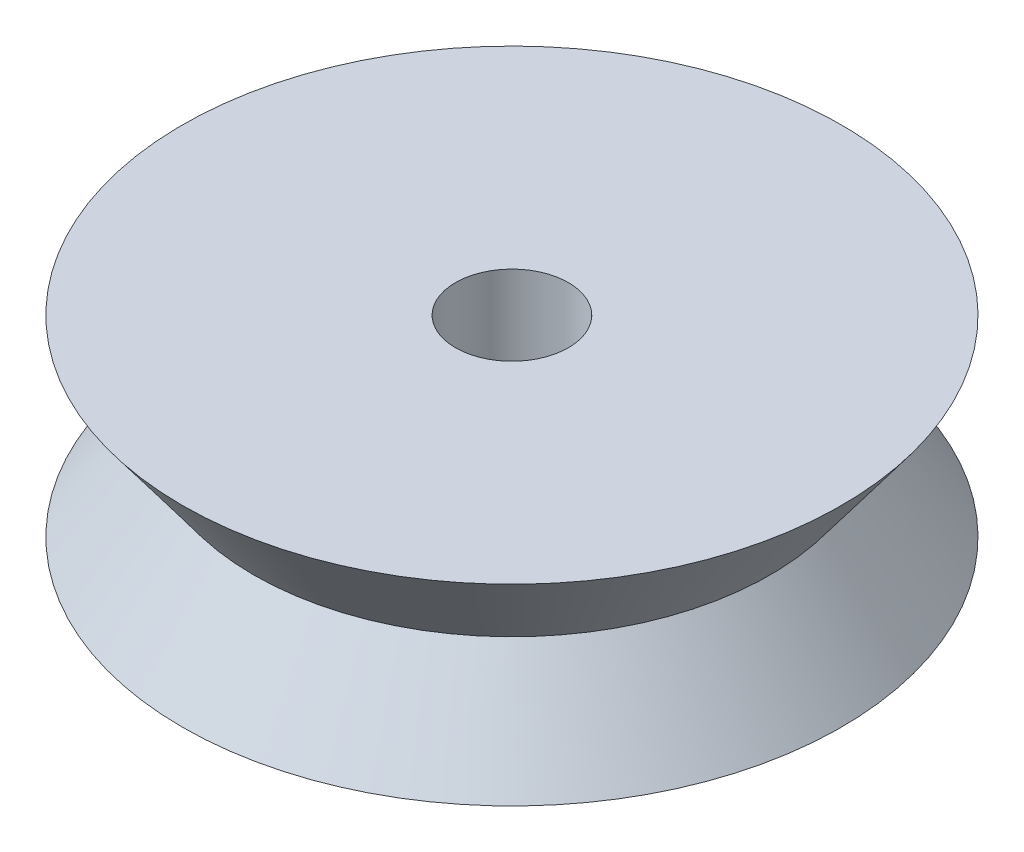
ISO-10303-21;
HEADER;
FILE_DESCRIPTION(('STEP AP214'),'2;1');
FILE_NAME('part.step','',(''),(''),'','','');
FILE_SCHEMA(('AUTOMOTIVE_DESIGN { 1 0 10303 214 1 1 1 1 }'));
ENDSEC;
DATA;
#1=APPLICATION_CONTEXT('core data for automotive mechanical design processes');
#2=APPLICATION_PROTOCOL_DEFINITION('international standard','automotive_design',2000,#1);
#3=PRODUCT_CONTEXT('',#1,'mechanical');
#4=PRODUCT('Part','Part','',(#3));
#5=PRODUCT_RELATED_PRODUCT_CATEGORY('part','',(#4));
#6=PRODUCT_DEFINITION_FORMATION('','',#4);
#7=PRODUCT_DEFINITION_CONTEXT('part definition',#1,'design');
#8=PRODUCT_DEFINITION('design','',#6,#7);
#9=PRODUCT_DEFINITION_SHAPE('','',#8);
#10=(LENGTH_UNIT() NAMED_UNIT(*) SI_UNIT(.MILLI.,.METRE.));
#11=(NAMED_UNIT(*) PLANE_ANGLE_UNIT() SI_UNIT($,.RADIAN.));
#12=(NAMED_UNIT(*) SI_UNIT($,.STERADIAN.) SOLID_ANGLE_UNIT());
#13=UNCERTAINTY_MEASURE_WITH_UNIT(LENGTH_MEASURE(1.E-05),#10,'distance_accuracy_value','');
#14=(GEOMETRIC_REPRESENTATION_CONTEXT(3) GLOBAL_UNCERTAINTY_ASSIGNED_CONTEXT((#13)) GLOBAL_UNIT_ASSIGNED_CONTEXT((#10,
#11,#12)) REPRESENTATION_CONTEXT('',''));
#15=CARTESIAN_POINT('',(0.,0.,0.));
#16=DIRECTION('',(0.,0.,1.));
#17=DIRECTION('',(1.,0.,0.));
#18=AXIS2_PLACEMENT_3D('',#15,#16,#17);
#19=CARTESIAN_POINT('',(0.,8.5,0.));
#20=DIRECTION('',(0.,-1.,0.));
#21=DIRECTION('',(0.,0.,-1.));
#22=AXIS2_PLACEMENT_3D('',#19,#20,#21);
#23=PLANE('',#22);
#24=CARTESIAN_POINT('',(0.,8.5,0.));
#25=DIRECTION('',(0.,1.,0.));
#26=DIRECTION('',(0.,0.,1.));
#27=AXIS2_PLACEMENT_3D('',#24,#25,#26);
#28=CIRCLE('',#27,5.);
#29=CARTESIAN_POINT('',(0.,8.5,5.));
#30=VERTEX_POINT('',#29);
#31=EDGE_CURVE('E62',#30,#30,#28,.T.);
#32=ORIENTED_EDGE('',*,*,#31,.F.);
#33=EDGE_LOOP('',(#32));
#34=FACE_BOUND('',#33,.T.);
#35=CARTESIAN_POINT('',(0.,8.5,0.));
#36=DIRECTION('',(0.,1.,0.));
#37=DIRECTION('',(0.,0.,1.));
#38=AXIS2_PLACEMENT_3D('',#35,#36,#37);
#39=CIRCLE('',#38,29.175);
#40=CARTESIAN_POINT('',(0.,8.5,29.175));
#41=VERTEX_POINT('',#40);
#42=EDGE_CURVE('E10',#41,#41,#39,.T.);
#43=ORIENTED_EDGE('',*,*,#42,.T.);
#44=EDGE_LOOP('',(#43));
#45=FACE_BOUND('',#44,.T.);
#46=ADVANCED_FACE('F39',(#34,#45),#23,.F.);
#47=CARTESIAN_POINT('',(0.,0.,0.));
#48=DIRECTION('',(0.,1.,0.));
#49=DIRECTION('',(0.,0.,1.));
#50=AXIS2_PLACEMENT_3D('',#47,#48,#49);
#51=CONICAL_SURFACE('',#50,22.85,0.639725760991824);
#52=ORIENTED_EDGE('',*,*,#42,.F.);
#53=EDGE_LOOP('',(#52));
#54=FACE_BOUND('',#53,.T.);
#55=CARTESIAN_POINT('',(0.,0.,0.));
#56=DIRECTION('',(0.,1.,0.));
#57=DIRECTION('',(0.,0.,1.));
#58=AXIS2_PLACEMENT_3D('',#55,#56,#57);
#59=CIRCLE('',#58,22.85);
#60=CARTESIAN_POINT('',(0.,0.,22.85));
#61=VERTEX_POINT('',#60);
#62=EDGE_CURVE('E46',#61,#61,#59,.T.);
#63=ORIENTED_EDGE('',*,*,#62,.T.);
#64=EDGE_LOOP('',(#63));
#65=FACE_BOUND('',#64,.T.);
#66=ADVANCED_FACE('F70',(#54,#65),#51,.T.);
#67=CARTESIAN_POINT('',(0.,0.,0.));
#68=DIRECTION('',(0.,-1.,0.));
#69=DIRECTION('',(0.,0.,-1.));
#70=AXIS2_PLACEMENT_3D('',#67,#68,#69);
#71=CONICAL_SURFACE('',#70,22.85,0.639725760991824);
#72=CARTESIAN_POINT('',(0.,-8.50000000000001,0.));
#73=DIRECTION('',(0.,1.,0.));
#74=DIRECTION('',(0.,0.,1.));
#75=AXIS2_PLACEMENT_3D('',#72,#73,#74);
#76=CIRCLE('',#75,29.175);
#77=CARTESIAN_POINT('',(0.,-8.50000000000001,29.175));
#78=VERTEX_POINT('',#77);
#79=EDGE_CURVE('E51',#78,#78,#76,.T.);
#80=ORIENTED_EDGE('',*,*,#79,.T.);
#81=EDGE_LOOP('',(#80));
#82=FACE_BOUND('',#81,.T.);
#83=ORIENTED_EDGE('',*,*,#62,.F.);
#84=EDGE_LOOP('',(#83));
#85=FACE_BOUND('',#84,.T.);
#86=ADVANCED_FACE('F74',(#82,#85),#71,.T.);
#87=CARTESIAN_POINT('',(0.,-8.5,0.));
#88=DIRECTION('',(0.,-1.,0.));
#89=DIRECTION('',(0.,0.,-1.));
#90=AXIS2_PLACEMENT_3D('',#87,#88,#89);
#91=PLANE('',#90);
#92=CARTESIAN_POINT('',(0.,-8.5,0.));
#93=DIRECTION('',(0.,1.,0.));
#94=DIRECTION('',(0.,0.,1.));
#95=AXIS2_PLACEMENT_3D('',#92,#93,#94);
#96=CIRCLE('',#95,4.99999999999999);
#97=CARTESIAN_POINT('',(0.,-8.5,4.99999999999999));
#98=VERTEX_POINT('',#97);
#99=EDGE_CURVE('E56',#98,#98,#96,.T.);
#100=ORIENTED_EDGE('',*,*,#99,.T.);
#101=EDGE_LOOP('',(#100));
#102=FACE_BOUND('',#101,.T.);
#103=ORIENTED_EDGE('',*,*,#79,.F.);
#104=EDGE_LOOP('',(#103));
#105=FACE_BOUND('',#104,.T.);
#106=ADVANCED_FACE('F79',(#102,#105),#91,.T.);
#107=CARTESIAN_POINT('',(0.,10.4841154400475,0.));
#108=DIRECTION('',(0.,1.,0.));
#109=DIRECTION('',(0.,0.,1.));
#110=AXIS2_PLACEMENT_3D('',#107,#108,#109);
#111=CYLINDRICAL_SURFACE('',#110,4.99999999999999);
#112=ORIENTED_EDGE('',*,*,#99,.F.);
#113=EDGE_LOOP('',(#112));
#114=FACE_BOUND('',#113,.T.);
#115=ORIENTED_EDGE('',*,*,#31,.T.);
#116=EDGE_LOOP('',(#115));
#117=FACE_BOUND('',#116,.T.);
#118=ADVANCED_FACE('F67',(#114,#117),#111,.F.);
#119=CLOSED_SHELL('',(#46,#66,#86,#106,#118));
#120=MANIFOLD_SOLID_BREP('B2',#119);
#121=ADVANCED_BREP_SHAPE_REPRESENTATION('',(#18,#120),#14);
#122=SHAPE_DEFINITION_REPRESENTATION(#9,#121);
ENDSEC;
END-ISO-10303-21;
